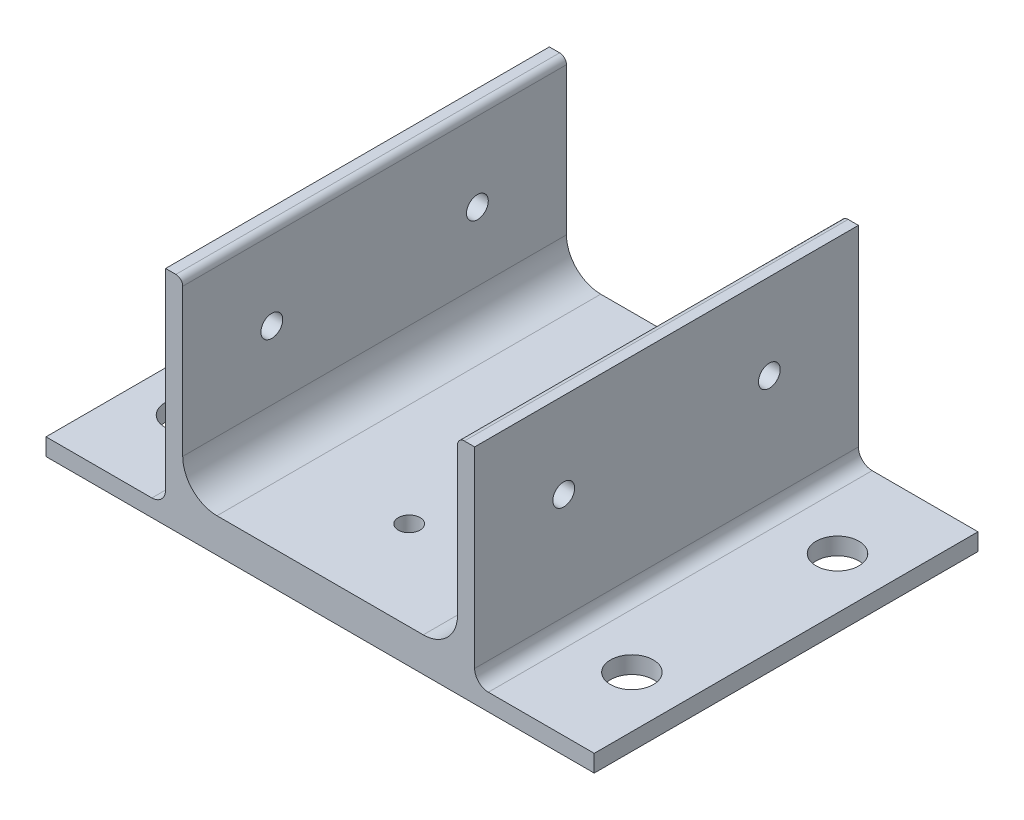
ISO-10303-21;
HEADER;
FILE_DESCRIPTION(('STEP AP214'),'2;1');
FILE_NAME('part.step','',(''),(''),'','','');
FILE_SCHEMA(('AUTOMOTIVE_DESIGN { 1 0 10303 214 1 1 1 1 }'));
ENDSEC;
DATA;
#1=APPLICATION_CONTEXT('core data for automotive mechanical design processes');
#2=APPLICATION_PROTOCOL_DEFINITION('international standard','automotive_design',2000,#1);
#3=PRODUCT_CONTEXT('',#1,'mechanical');
#4=PRODUCT('Part','Part','',(#3));
#5=PRODUCT_RELATED_PRODUCT_CATEGORY('part','',(#4));
#6=PRODUCT_DEFINITION_FORMATION('','',#4);
#7=PRODUCT_DEFINITION_CONTEXT('part definition',#1,'design');
#8=PRODUCT_DEFINITION('design','',#6,#7);
#9=PRODUCT_DEFINITION_SHAPE('','',#8);
#10=(LENGTH_UNIT() NAMED_UNIT(*) SI_UNIT(.MILLI.,.METRE.));
#11=(NAMED_UNIT(*) PLANE_ANGLE_UNIT() SI_UNIT($,.RADIAN.));
#12=(NAMED_UNIT(*) SI_UNIT($,.STERADIAN.) SOLID_ANGLE_UNIT());
#13=UNCERTAINTY_MEASURE_WITH_UNIT(LENGTH_MEASURE(1.E-05),#10,'distance_accuracy_value','');
#14=(GEOMETRIC_REPRESENTATION_CONTEXT(3) GLOBAL_UNCERTAINTY_ASSIGNED_CONTEXT((#13)) GLOBAL_UNIT_ASSIGNED_CONTEXT((#10,
#11,#12)) REPRESENTATION_CONTEXT('',''));
#15=CARTESIAN_POINT('',(0.,0.,0.));
#16=DIRECTION('',(0.,0.,1.));
#17=DIRECTION('',(1.,0.,0.));
#18=AXIS2_PLACEMENT_3D('',#15,#16,#17);
#19=CARTESIAN_POINT('',(25.4635,34.925,54.61));
#20=DIRECTION('',(0.,-1.,0.));
#21=DIRECTION('',(1.,0.,0.));
#22=AXIS2_PLACEMENT_3D('',#19,#20,#21);
#23=CYLINDRICAL_SURFACE('',#22,2.0193);
#24=CARTESIAN_POINT('',(25.4635,0.,54.61));
#25=DIRECTION('',(0.,-1.,0.));
#26=DIRECTION('',(1.,0.,0.));
#27=AXIS2_PLACEMENT_3D('',#24,#25,#26);
#28=CIRCLE('',#27,2.0193);
#29=CARTESIAN_POINT('',(27.4828,0.,54.61));
#30=VERTEX_POINT('',#29);
#31=EDGE_CURVE('E401',#30,#30,#28,.T.);
#32=ORIENTED_EDGE('',*,*,#31,.F.);
#33=EDGE_LOOP('',(#32));
#34=FACE_BOUND('',#33,.T.);
#35=CARTESIAN_POINT('',(25.4635,-3.17499999999999,54.61));
#36=DIRECTION('',(0.,-1.,0.));
#37=DIRECTION('',(1.,0.,0.));
#38=AXIS2_PLACEMENT_3D('',#35,#36,#37);
#39=CIRCLE('',#38,2.0193);
#40=CARTESIAN_POINT('',(27.4828,-3.17499999999999,54.61));
#41=VERTEX_POINT('',#40);
#42=EDGE_CURVE('E42',#41,#41,#39,.F.);
#43=ORIENTED_EDGE('',*,*,#42,.F.);
#44=EDGE_LOOP('',(#43));
#45=FACE_BOUND('',#44,.T.);
#46=ADVANCED_FACE('F38',(#34,#45),#23,.F.);
#47=CARTESIAN_POINT('',(25.4635,34.925,16.51));
#48=DIRECTION('',(0.,-1.,0.));
#49=DIRECTION('',(1.,0.,0.));
#50=AXIS2_PLACEMENT_3D('',#47,#48,#49);
#51=CYLINDRICAL_SURFACE('',#50,2.0193);
#52=CARTESIAN_POINT('',(25.4635,0.,16.51));
#53=DIRECTION('',(0.,-1.,0.));
#54=DIRECTION('',(1.,0.,0.));
#55=AXIS2_PLACEMENT_3D('',#52,#53,#54);
#56=CIRCLE('',#55,2.0193);
#57=CARTESIAN_POINT('',(27.4828,0.,16.51));
#58=VERTEX_POINT('',#57);
#59=EDGE_CURVE('E405',#58,#58,#56,.T.);
#60=ORIENTED_EDGE('',*,*,#59,.F.);
#61=EDGE_LOOP('',(#60));
#62=FACE_BOUND('',#61,.T.);
#63=CARTESIAN_POINT('',(25.4635,-3.17499999999999,16.51));
#64=DIRECTION('',(0.,-1.,0.));
#65=DIRECTION('',(1.,0.,0.));
#66=AXIS2_PLACEMENT_3D('',#63,#64,#65);
#67=CIRCLE('',#66,2.0193);
#68=CARTESIAN_POINT('',(27.4828,-3.17499999999999,16.51));
#69=VERTEX_POINT('',#68);
#70=EDGE_CURVE('E353',#69,#69,#67,.F.);
#71=ORIENTED_EDGE('',*,*,#70,.F.);
#72=EDGE_LOOP('',(#71));
#73=FACE_BOUND('',#72,.T.);
#74=ADVANCED_FACE('F471',(#62,#73),#51,.F.);
#75=CARTESIAN_POINT('',(6.35,6.34999999999999,71.12));
#76=DIRECTION('',(0.,0.,-1.));
#77=DIRECTION('',(-1.,0.,0.));
#78=AXIS2_PLACEMENT_3D('',#75,#76,#77);
#79=CYLINDRICAL_SURFACE('',#78,6.35);
#80=CARTESIAN_POINT('',(6.35,6.34999999999999,0.));
#81=DIRECTION('',(0.,0.,-1.));
#82=DIRECTION('',(1.,0.,0.));
#83=AXIS2_PLACEMENT_3D('',#80,#81,#82);
#84=CIRCLE('',#83,6.35);
#85=CARTESIAN_POINT('',(6.35,0.,0.));
#86=VERTEX_POINT('',#85);
#87=CARTESIAN_POINT('',(0.,6.34999999999999,0.));
#88=VERTEX_POINT('',#87);
#89=EDGE_CURVE('E224',#86,#88,#84,.T.);
#90=ORIENTED_EDGE('',*,*,#89,.T.);
#91=DIRECTION('',(0.,0.,-1.));
#92=VECTOR('',#91,1.);
#93=CARTESIAN_POINT('',(0.,6.34999999999999,71.12));
#94=LINE('',#93,#92);
#95=CARTESIAN_POINT('',(0.,6.34999999999999,71.12));
#96=VERTEX_POINT('',#95);
#97=EDGE_CURVE('E281',#96,#88,#94,.T.);
#98=ORIENTED_EDGE('',*,*,#97,.F.);
#99=CARTESIAN_POINT('',(6.35,6.34999999999999,71.12));
#100=DIRECTION('',(0.,0.,-1.));
#101=DIRECTION('',(1.,0.,0.));
#102=AXIS2_PLACEMENT_3D('',#99,#100,#101);
#103=CIRCLE('',#102,6.35);
#104=CARTESIAN_POINT('',(6.35,0.,71.12));
#105=VERTEX_POINT('',#104);
#106=EDGE_CURVE('E225',#105,#96,#103,.T.);
#107=ORIENTED_EDGE('',*,*,#106,.F.);
#108=DIRECTION('',(0.,0.,-1.));
#109=VECTOR('',#108,1.);
#110=CARTESIAN_POINT('',(6.35,0.,71.12));
#111=LINE('',#110,#109);
#112=EDGE_CURVE('E246',#105,#86,#111,.T.);
#113=ORIENTED_EDGE('',*,*,#112,.T.);
#114=EDGE_LOOP('',(#90,#98,#107,#113));
#115=FACE_BOUND('',#114,.T.);
#116=ADVANCED_FACE('F478',(#115),#79,.F.);
#117=CARTESIAN_POINT('',(0.,6.34999999999999,71.12));
#118=DIRECTION('',(-1.,0.,0.));
#119=DIRECTION('',(0.,-1.,0.));
#120=AXIS2_PLACEMENT_3D('',#117,#118,#119);
#121=PLANE('',#120);
#122=CARTESIAN_POINT('',(0.,19.05,16.51));
#123=DIRECTION('',(-1.,0.,0.));
#124=DIRECTION('',(0.,-1.,0.));
#125=AXIS2_PLACEMENT_3D('',#122,#123,#124);
#126=CIRCLE('',#125,2.0193);
#127=CARTESIAN_POINT('',(0.,17.0307,16.51));
#128=VERTEX_POINT('',#127);
#129=EDGE_CURVE('E425',#128,#128,#126,.T.);
#130=ORIENTED_EDGE('',*,*,#129,.T.);
#131=EDGE_LOOP('',(#130));
#132=FACE_BOUND('',#131,.T.);
#133=CARTESIAN_POINT('',(0.,19.05,54.61));
#134=DIRECTION('',(-1.,0.,0.));
#135=DIRECTION('',(0.,-1.,0.));
#136=AXIS2_PLACEMENT_3D('',#133,#134,#135);
#137=CIRCLE('',#136,2.0193);
#138=CARTESIAN_POINT('',(0.,17.0307,54.61));
#139=VERTEX_POINT('',#138);
#140=EDGE_CURVE('E323',#139,#139,#137,.T.);
#141=ORIENTED_EDGE('',*,*,#140,.T.);
#142=EDGE_LOOP('',(#141));
#143=FACE_BOUND('',#142,.T.);
#144=DIRECTION('',(0.,1.,0.));
#145=VECTOR('',#144,1.);
#146=CARTESIAN_POINT('',(0.,6.34999999999999,0.));
#147=LINE('',#146,#145);
#148=CARTESIAN_POINT('',(0.,33.655,0.));
#149=VERTEX_POINT('',#148);
#150=EDGE_CURVE('E250',#88,#149,#147,.T.);
#151=ORIENTED_EDGE('',*,*,#150,.T.);
#152=DIRECTION('',(0.,0.,-1.));
#153=VECTOR('',#152,1.);
#154=CARTESIAN_POINT('',(0.,33.655,71.12));
#155=LINE('',#154,#153);
#156=CARTESIAN_POINT('',(0.,33.655,71.12));
#157=VERTEX_POINT('',#156);
#158=EDGE_CURVE('E277',#157,#149,#155,.T.);
#159=ORIENTED_EDGE('',*,*,#158,.F.);
#160=DIRECTION('',(0.,1.,0.));
#161=VECTOR('',#160,1.);
#162=CARTESIAN_POINT('',(0.,6.34999999999999,71.12));
#163=LINE('',#162,#161);
#164=EDGE_CURVE('E229',#96,#157,#163,.T.);
#165=ORIENTED_EDGE('',*,*,#164,.F.);
#166=ORIENTED_EDGE('',*,*,#97,.T.);
#167=EDGE_LOOP('',(#151,#159,#165,#166));
#168=FACE_BOUND('',#167,.T.);
#169=ADVANCED_FACE('F537',(#132,#143,#168),#121,.F.);
#170=CARTESIAN_POINT('',(-1.27,33.655,71.12));
#171=DIRECTION('',(0.,0.,-1.));
#172=DIRECTION('',(-1.,0.,0.));
#173=AXIS2_PLACEMENT_3D('',#170,#171,#172);
#174=CYLINDRICAL_SURFACE('',#173,1.27);
#175=CARTESIAN_POINT('',(-1.27,33.655,0.));
#176=DIRECTION('',(0.,0.,1.));
#177=DIRECTION('',(1.,0.,0.));
#178=AXIS2_PLACEMENT_3D('',#175,#176,#177);
#179=CIRCLE('',#178,1.27);
#180=CARTESIAN_POINT('',(-1.27,34.925,0.));
#181=VERTEX_POINT('',#180);
#182=EDGE_CURVE('E253',#149,#181,#179,.T.);
#183=ORIENTED_EDGE('',*,*,#182,.T.);
#184=DIRECTION('',(0.,0.,-1.));
#185=VECTOR('',#184,1.);
#186=CARTESIAN_POINT('',(-1.27,34.925,71.12));
#187=LINE('',#186,#185);
#188=CARTESIAN_POINT('',(-1.27,34.925,71.12));
#189=VERTEX_POINT('',#188);
#190=EDGE_CURVE('E273',#189,#181,#187,.T.);
#191=ORIENTED_EDGE('',*,*,#190,.F.);
#192=CARTESIAN_POINT('',(-1.27,33.655,71.12));
#193=DIRECTION('',(0.,0.,1.));
#194=DIRECTION('',(1.,0.,0.));
#195=AXIS2_PLACEMENT_3D('',#192,#193,#194);
#196=CIRCLE('',#195,1.27);
#197=EDGE_CURVE('E233',#157,#189,#196,.T.);
#198=ORIENTED_EDGE('',*,*,#197,.F.);
#199=ORIENTED_EDGE('',*,*,#158,.T.);
#200=EDGE_LOOP('',(#183,#191,#198,#199));
#201=FACE_BOUND('',#200,.T.);
#202=ADVANCED_FACE('F533',(#201),#174,.T.);
#203=CARTESIAN_POINT('',(-1.27,34.925,71.12));
#204=DIRECTION('',(0.,-1.,0.));
#205=DIRECTION('',(0.,0.,-1.));
#206=AXIS2_PLACEMENT_3D('',#203,#204,#205);
#207=PLANE('',#206);
#208=DIRECTION('',(-1.,0.,0.));
#209=VECTOR('',#208,1.);
#210=CARTESIAN_POINT('',(-1.27,34.925,0.));
#211=LINE('',#210,#209);
#212=CARTESIAN_POINT('',(-3.175,34.925,0.));
#213=VERTEX_POINT('',#212);
#214=EDGE_CURVE('E256',#181,#213,#211,.T.);
#215=ORIENTED_EDGE('',*,*,#214,.T.);
#216=DIRECTION('',(0.,0.,-1.));
#217=VECTOR('',#216,1.);
#218=CARTESIAN_POINT('',(-3.175,34.925,71.12));
#219=LINE('',#218,#217);
#220=CARTESIAN_POINT('',(-3.175,34.925,71.12));
#221=VERTEX_POINT('',#220);
#222=EDGE_CURVE('E269',#221,#213,#219,.T.);
#223=ORIENTED_EDGE('',*,*,#222,.F.);
#224=DIRECTION('',(-1.,0.,0.));
#225=VECTOR('',#224,1.);
#226=CARTESIAN_POINT('',(-1.27,34.925,71.12));
#227=LINE('',#226,#225);
#228=EDGE_CURVE('E236',#189,#221,#227,.T.);
#229=ORIENTED_EDGE('',*,*,#228,.F.);
#230=ORIENTED_EDGE('',*,*,#190,.T.);
#231=EDGE_LOOP('',(#215,#223,#229,#230));
#232=FACE_BOUND('',#231,.T.);
#233=ADVANCED_FACE('F528',(#232),#207,.F.);
#234=CARTESIAN_POINT('',(-3.17500000000001,-3.17499999999999,71.12));
#235=DIRECTION('',(1.,0.,0.));
#236=DIRECTION('',(0.,1.,0.));
#237=AXIS2_PLACEMENT_3D('',#234,#235,#236);
#238=PLANE('',#237);
#239=CARTESIAN_POINT('',(-3.175,19.05,16.51));
#240=DIRECTION('',(-1.,0.,0.));
#241=DIRECTION('',(0.,-1.,0.));
#242=AXIS2_PLACEMENT_3D('',#239,#240,#241);
#243=CIRCLE('',#242,2.0193);
#244=CARTESIAN_POINT('',(-3.175,17.0307,16.51));
#245=VERTEX_POINT('',#244);
#246=EDGE_CURVE('E317',#245,#245,#243,.T.);
#247=ORIENTED_EDGE('',*,*,#246,.F.);
#248=EDGE_LOOP('',(#247));
#249=FACE_BOUND('',#248,.T.);
#250=CARTESIAN_POINT('',(-3.175,19.05,54.61));
#251=DIRECTION('',(-1.,0.,0.));
#252=DIRECTION('',(0.,-1.,0.));
#253=AXIS2_PLACEMENT_3D('',#250,#251,#252);
#254=CIRCLE('',#253,2.0193);
#255=CARTESIAN_POINT('',(-3.175,17.0307,54.61));
#256=VERTEX_POINT('',#255);
#257=EDGE_CURVE('E409',#256,#256,#254,.T.);
#258=ORIENTED_EDGE('',*,*,#257,.F.);
#259=EDGE_LOOP('',(#258));
#260=FACE_BOUND('',#259,.T.);
#261=DIRECTION('',(0.,-1.,0.));
#262=VECTOR('',#261,1.);
#263=CARTESIAN_POINT('',(-3.17500000000001,-3.17499999999999,0.));
#264=LINE('',#263,#262);
#265=CARTESIAN_POINT('',(-3.175,-0.634999999999995,0.));
#266=VERTEX_POINT('',#265);
#267=EDGE_CURVE('E260',#213,#266,#264,.T.);
#268=ORIENTED_EDGE('',*,*,#267,.T.);
#269=DIRECTION('',(0.,0.,-1.));
#270=VECTOR('',#269,1.);
#271=CARTESIAN_POINT('',(-3.175,-0.634999999999995,71.12));
#272=LINE('',#271,#270);
#273=CARTESIAN_POINT('',(-3.175,-0.634999999999997,71.12));
#274=VERTEX_POINT('',#273);
#275=EDGE_CURVE('E337',#266,#274,#272,.F.);
#276=ORIENTED_EDGE('',*,*,#275,.T.);
#277=DIRECTION('',(0.,-1.,0.));
#278=VECTOR('',#277,1.);
#279=CARTESIAN_POINT('',(-3.175,34.925,71.12));
#280=LINE('',#279,#278);
#281=EDGE_CURVE('E239',#221,#274,#280,.T.);
#282=ORIENTED_EDGE('',*,*,#281,.F.);
#283=ORIENTED_EDGE('',*,*,#222,.T.);
#284=EDGE_LOOP('',(#268,#276,#282,#283));
#285=FACE_BOUND('',#284,.T.);
#286=ADVANCED_FACE('F523',(#249,#260,#285),#238,.F.);
#287=CARTESIAN_POINT('',(33.655,0.,71.12));
#288=DIRECTION('',(0.,-1.,0.));
#289=DIRECTION('',(1.,0.,0.));
#290=AXIS2_PLACEMENT_3D('',#287,#288,#289);
#291=PLANE('',#290);
#292=ORIENTED_EDGE('',*,*,#59,.T.);
#293=EDGE_LOOP('',(#292));
#294=FACE_BOUND('',#293,.T.);
#295=ORIENTED_EDGE('',*,*,#31,.T.);
#296=EDGE_LOOP('',(#295));
#297=FACE_BOUND('',#296,.T.);
#298=DIRECTION('',(-1.,0.,0.));
#299=VECTOR('',#298,1.);
#300=CARTESIAN_POINT('',(33.655,0.,71.12));
#301=LINE('',#300,#299);
#302=CARTESIAN_POINT('',(44.577,0.,71.12));
#303=VERTEX_POINT('',#302);
#304=EDGE_CURVE('E243',#303,#105,#301,.T.);
#305=ORIENTED_EDGE('',*,*,#304,.F.);
#306=DIRECTION('',(0.,0.,-1.));
#307=VECTOR('',#306,1.);
#308=CARTESIAN_POINT('',(44.577,0.,71.12));
#309=LINE('',#308,#307);
#310=CARTESIAN_POINT('',(44.577,0.,0.));
#311=VERTEX_POINT('',#310);
#312=EDGE_CURVE('E285',#303,#311,#309,.T.);
#313=ORIENTED_EDGE('',*,*,#312,.T.);
#314=DIRECTION('',(-1.,0.,0.));
#315=VECTOR('',#314,1.);
#316=CARTESIAN_POINT('',(33.655,0.,0.));
#317=LINE('',#316,#315);
#318=EDGE_CURVE('E230',#311,#86,#317,.T.);
#319=ORIENTED_EDGE('',*,*,#318,.T.);
#320=ORIENTED_EDGE('',*,*,#112,.F.);
#321=EDGE_LOOP('',(#305,#313,#319,#320));
#322=FACE_BOUND('',#321,.T.);
#323=ADVANCED_FACE('F546',(#294,#297,#322),#291,.F.);
#324=CARTESIAN_POINT('',(6.35,6.34999999999999,71.12));
#325=DIRECTION('',(0.,0.,1.));
#326=DIRECTION('',(1.,0.,0.));
#327=AXIS2_PLACEMENT_3D('',#324,#325,#326);
#328=PLANE('',#327);
#329=DIRECTION('',(1.,0.,0.));
#330=VECTOR('',#329,1.);
#331=CARTESIAN_POINT('',(54.102,34.925,71.12));
#332=LINE('',#331,#330);
#333=CARTESIAN_POINT('',(52.197,34.925,71.12));
#334=VERTEX_POINT('',#333);
#335=CARTESIAN_POINT('',(54.102,34.925,71.12));
#336=VERTEX_POINT('',#335);
#337=EDGE_CURVE('E208',#334,#336,#332,.T.);
#338=ORIENTED_EDGE('',*,*,#337,.F.);
#339=CARTESIAN_POINT('',(52.197,33.655,71.12));
#340=DIRECTION('',(0.,0.,1.));
#341=DIRECTION('',(1.,0.,0.));
#342=AXIS2_PLACEMENT_3D('',#339,#340,#341);
#343=CIRCLE('',#342,1.27);
#344=CARTESIAN_POINT('',(50.927,33.655,71.12));
#345=VERTEX_POINT('',#344);
#346=EDGE_CURVE('E308',#334,#345,#343,.T.);
#347=ORIENTED_EDGE('',*,*,#346,.T.);
#348=DIRECTION('',(0.,1.,0.));
#349=VECTOR('',#348,1.);
#350=CARTESIAN_POINT('',(50.927,34.925,71.12));
#351=LINE('',#350,#349);
#352=CARTESIAN_POINT('',(50.927,6.35000000000001,71.12));
#353=VERTEX_POINT('',#352);
#354=EDGE_CURVE('E204',#353,#345,#351,.T.);
#355=ORIENTED_EDGE('',*,*,#354,.F.);
#356=CARTESIAN_POINT('',(44.577,6.35,71.12));
#357=DIRECTION('',(0.,0.,1.));
#358=DIRECTION('',(1.,0.,0.));
#359=AXIS2_PLACEMENT_3D('',#356,#357,#358);
#360=CIRCLE('',#359,6.35);
#361=EDGE_CURVE('E295',#353,#303,#360,.F.);
#362=ORIENTED_EDGE('',*,*,#361,.T.);
#363=ORIENTED_EDGE('',*,*,#304,.T.);
#364=ORIENTED_EDGE('',*,*,#106,.T.);
#365=ORIENTED_EDGE('',*,*,#164,.T.);
#366=ORIENTED_EDGE('',*,*,#197,.T.);
#367=ORIENTED_EDGE('',*,*,#228,.T.);
#368=ORIENTED_EDGE('',*,*,#281,.T.);
#369=CARTESIAN_POINT('',(-5.715,-0.634999999999985,71.12));
#370=DIRECTION('',(0.,0.,1.));
#371=DIRECTION('',(1.,0.,0.));
#372=AXIS2_PLACEMENT_3D('',#369,#370,#371);
#373=CIRCLE('',#372,2.54);
#374=CARTESIAN_POINT('',(-5.71500000000001,-3.17499999999999,71.12));
#375=VERTEX_POINT('',#374);
#376=EDGE_CURVE('E349',#274,#375,#373,.F.);
#377=ORIENTED_EDGE('',*,*,#376,.T.);
#378=DIRECTION('',(-1.,0.,0.));
#379=VECTOR('',#378,1.);
#380=CARTESIAN_POINT('',(-25.3365,-3.17499999999998,71.12));
#381=LINE('',#380,#379);
#382=CARTESIAN_POINT('',(-25.3365,-3.17499999999998,71.12));
#383=VERTEX_POINT('',#382);
#384=EDGE_CURVE('E443',#375,#383,#381,.T.);
#385=ORIENTED_EDGE('',*,*,#384,.T.);
#386=DIRECTION('',(0.,1.,0.));
#387=VECTOR('',#386,1.);
#388=CARTESIAN_POINT('',(-25.3365,-6.34999999999998,71.12));
#389=LINE('',#388,#387);
#390=CARTESIAN_POINT('',(-25.3365,-6.34999999999998,71.12));
#391=VERTEX_POINT('',#390);
#392=EDGE_CURVE('E433',#391,#383,#389,.T.);
#393=ORIENTED_EDGE('',*,*,#392,.F.);
#394=DIRECTION('',(-1.,0.,0.));
#395=VECTOR('',#394,1.);
#396=CARTESIAN_POINT('',(-25.3365,-6.34999999999998,71.12));
#397=LINE('',#396,#395);
#398=CARTESIAN_POINT('',(76.2635,-6.35,71.1199999999999));
#399=VERTEX_POINT('',#398);
#400=EDGE_CURVE('E183',#399,#391,#397,.T.);
#401=ORIENTED_EDGE('',*,*,#400,.F.);
#402=DIRECTION('',(0.,1.,0.));
#403=VECTOR('',#402,1.);
#404=CARTESIAN_POINT('',(76.2635,-6.35,71.1199999999999));
#405=LINE('',#404,#403);
#406=CARTESIAN_POINT('',(76.2635,-3.175,71.1199999999999));
#407=VERTEX_POINT('',#406);
#408=EDGE_CURVE('E200',#399,#407,#405,.T.);
#409=ORIENTED_EDGE('',*,*,#408,.T.);
#410=CARTESIAN_POINT('',(56.642,-3.175,71.1199999999999));
#411=VERTEX_POINT('',#410);
#412=EDGE_CURVE('E188',#407,#411,#381,.T.);
#413=ORIENTED_EDGE('',*,*,#412,.T.);
#414=CARTESIAN_POINT('',(56.642,-0.634999999999998,71.12));
#415=DIRECTION('',(0.,0.,1.));
#416=DIRECTION('',(1.,0.,0.));
#417=AXIS2_PLACEMENT_3D('',#414,#415,#416);
#418=CIRCLE('',#417,2.54);
#419=CARTESIAN_POINT('',(54.102,-0.634999999999998,71.12));
#420=VERTEX_POINT('',#419);
#421=EDGE_CURVE('E11',#411,#420,#418,.F.);
#422=ORIENTED_EDGE('',*,*,#421,.T.);
#423=DIRECTION('',(0.,-1.,0.));
#424=VECTOR('',#423,1.);
#425=CARTESIAN_POINT('',(54.102,-3.17499999999999,71.12));
#426=LINE('',#425,#424);
#427=EDGE_CURVE('E212',#336,#420,#426,.T.);
#428=ORIENTED_EDGE('',*,*,#427,.F.);
#429=EDGE_LOOP('',(#338,#347,#355,#362,#363,#364,#365,#366,#367,#368,#377,#385,#393,#401,#409,
#413,#422,#428));
#430=FACE_BOUND('',#429,.T.);
#431=ADVANCED_FACE('F452',(#430),#328,.T.);
#432=CARTESIAN_POINT('',(6.35,6.34999999999999,0.));
#433=DIRECTION('',(0.,0.,1.));
#434=DIRECTION('',(1.,0.,0.));
#435=AXIS2_PLACEMENT_3D('',#432,#433,#434);
#436=PLANE('',#435);
#437=DIRECTION('',(0.,1.,0.));
#438=VECTOR('',#437,1.);
#439=CARTESIAN_POINT('',(50.927,34.925,0.));
#440=LINE('',#439,#438);
#441=CARTESIAN_POINT('',(50.927,6.35000000000001,0.));
#442=VERTEX_POINT('',#441);
#443=CARTESIAN_POINT('',(50.927,33.655,0.));
#444=VERTEX_POINT('',#443);
#445=EDGE_CURVE('E194',#442,#444,#440,.T.);
#446=ORIENTED_EDGE('',*,*,#445,.T.);
#447=CARTESIAN_POINT('',(52.197,33.655,0.));
#448=DIRECTION('',(0.,0.,1.));
#449=DIRECTION('',(1.,0.,0.));
#450=AXIS2_PLACEMENT_3D('',#447,#448,#449);
#451=CIRCLE('',#450,1.27);
#452=CARTESIAN_POINT('',(52.197,34.925,0.));
#453=VERTEX_POINT('',#452);
#454=EDGE_CURVE('E302',#444,#453,#451,.F.);
#455=ORIENTED_EDGE('',*,*,#454,.T.);
#456=DIRECTION('',(1.,0.,0.));
#457=VECTOR('',#456,1.);
#458=CARTESIAN_POINT('',(54.102,34.925,0.));
#459=LINE('',#458,#457);
#460=CARTESIAN_POINT('',(54.102,34.925,0.));
#461=VERTEX_POINT('',#460);
#462=EDGE_CURVE('E198',#453,#461,#459,.T.);
#463=ORIENTED_EDGE('',*,*,#462,.T.);
#464=DIRECTION('',(0.,-1.,0.));
#465=VECTOR('',#464,1.);
#466=CARTESIAN_POINT('',(54.102,-3.17499999999999,0.));
#467=LINE('',#466,#465);
#468=CARTESIAN_POINT('',(54.102,-0.634999999999998,0.));
#469=VERTEX_POINT('',#468);
#470=EDGE_CURVE('E209',#461,#469,#467,.T.);
#471=ORIENTED_EDGE('',*,*,#470,.T.);
#472=CARTESIAN_POINT('',(56.642,-0.634999999999998,0.));
#473=DIRECTION('',(0.,0.,1.));
#474=DIRECTION('',(1.,0.,0.));
#475=AXIS2_PLACEMENT_3D('',#472,#473,#474);
#476=CIRCLE('',#475,2.54);
#477=CARTESIAN_POINT('',(56.642,-3.175,0.));
#478=VERTEX_POINT('',#477);
#479=EDGE_CURVE('E48',#469,#478,#476,.T.);
#480=ORIENTED_EDGE('',*,*,#479,.T.);
#481=DIRECTION('',(1.,0.,0.));
#482=VECTOR('',#481,1.);
#483=CARTESIAN_POINT('',(-25.3365,-3.17499999999998,0.));
#484=LINE('',#483,#482);
#485=CARTESIAN_POINT('',(76.2635,-3.175,0.));
#486=VERTEX_POINT('',#485);
#487=EDGE_CURVE('E436',#478,#486,#484,.T.);
#488=ORIENTED_EDGE('',*,*,#487,.T.);
#489=DIRECTION('',(0.,1.,0.));
#490=VECTOR('',#489,1.);
#491=CARTESIAN_POINT('',(76.2635,-6.35,0.));
#492=LINE('',#491,#490);
#493=CARTESIAN_POINT('',(76.2635,-6.35,0.));
#494=VERTEX_POINT('',#493);
#495=EDGE_CURVE('E173',#494,#486,#492,.T.);
#496=ORIENTED_EDGE('',*,*,#495,.F.);
#497=DIRECTION('',(1.,0.,0.));
#498=VECTOR('',#497,1.);
#499=CARTESIAN_POINT('',(-25.3365,-6.34999999999998,0.));
#500=LINE('',#499,#498);
#501=CARTESIAN_POINT('',(-25.3365,-6.34999999999998,0.));
#502=VERTEX_POINT('',#501);
#503=EDGE_CURVE('E164',#502,#494,#500,.T.);
#504=ORIENTED_EDGE('',*,*,#503,.F.);
#505=DIRECTION('',(0.,1.,0.));
#506=VECTOR('',#505,1.);
#507=CARTESIAN_POINT('',(-25.3365,-6.34999999999998,0.));
#508=LINE('',#507,#506);
#509=CARTESIAN_POINT('',(-25.3365,-3.17499999999998,0.));
#510=VERTEX_POINT('',#509);
#511=EDGE_CURVE('E170',#502,#510,#508,.T.);
#512=ORIENTED_EDGE('',*,*,#511,.T.);
#513=CARTESIAN_POINT('',(-5.715,-3.17499999999999,0.));
#514=VERTEX_POINT('',#513);
#515=EDGE_CURVE('E437',#510,#514,#484,.T.);
#516=ORIENTED_EDGE('',*,*,#515,.T.);
#517=CARTESIAN_POINT('',(-5.715,-0.634999999999985,0.));
#518=DIRECTION('',(0.,0.,1.));
#519=DIRECTION('',(1.,0.,0.));
#520=AXIS2_PLACEMENT_3D('',#517,#518,#519);
#521=CIRCLE('',#520,2.54);
#522=EDGE_CURVE('E346',#514,#266,#521,.T.);
#523=ORIENTED_EDGE('',*,*,#522,.T.);
#524=ORIENTED_EDGE('',*,*,#267,.F.);
#525=ORIENTED_EDGE('',*,*,#214,.F.);
#526=ORIENTED_EDGE('',*,*,#182,.F.);
#527=ORIENTED_EDGE('',*,*,#150,.F.);
#528=ORIENTED_EDGE('',*,*,#89,.F.);
#529=ORIENTED_EDGE('',*,*,#318,.F.);
#530=CARTESIAN_POINT('',(44.577,6.35,0.));
#531=DIRECTION('',(0.,0.,1.));
#532=DIRECTION('',(1.,0.,0.));
#533=AXIS2_PLACEMENT_3D('',#530,#531,#532);
#534=CIRCLE('',#533,6.35);
#535=EDGE_CURVE('E292',#311,#442,#534,.T.);
#536=ORIENTED_EDGE('',*,*,#535,.T.);
#537=EDGE_LOOP('',(#446,#455,#463,#471,#480,#488,#496,#504,#512,#516,#523,#524,#525,#526,#527,
#528,#529,#536));
#538=FACE_BOUND('',#537,.T.);
#539=ADVANCED_FACE('F167',(#538),#436,.F.);
#540=CARTESIAN_POINT('',(54.102,-3.17499999999999,71.12));
#541=DIRECTION('',(1.,0.,0.));
#542=DIRECTION('',(0.,0.,-1.));
#543=AXIS2_PLACEMENT_3D('',#540,#541,#542);
#544=PLANE('',#543);
#545=CARTESIAN_POINT('',(54.102,19.05,16.51));
#546=DIRECTION('',(1.,0.,0.));
#547=DIRECTION('',(0.,0.,-1.));
#548=AXIS2_PLACEMENT_3D('',#545,#546,#547);
#549=CIRCLE('',#548,2.0193);
#550=CARTESIAN_POINT('',(54.102,19.05,14.4907));
#551=VERTEX_POINT('',#550);
#552=EDGE_CURVE('E322',#551,#551,#549,.T.);
#553=ORIENTED_EDGE('',*,*,#552,.F.);
#554=EDGE_LOOP('',(#553));
#555=FACE_BOUND('',#554,.T.);
#556=CARTESIAN_POINT('',(54.102,19.05,54.61));
#557=DIRECTION('',(1.,0.,0.));
#558=DIRECTION('',(0.,0.,-1.));
#559=AXIS2_PLACEMENT_3D('',#556,#557,#558);
#560=CIRCLE('',#559,2.0193);
#561=CARTESIAN_POINT('',(54.102,19.05,52.5907));
#562=VERTEX_POINT('',#561);
#563=EDGE_CURVE('E316',#562,#562,#560,.T.);
#564=ORIENTED_EDGE('',*,*,#563,.F.);
#565=EDGE_LOOP('',(#564));
#566=FACE_BOUND('',#565,.T.);
#567=ORIENTED_EDGE('',*,*,#427,.T.);
#568=DIRECTION('',(0.,0.,-1.));
#569=VECTOR('',#568,1.);
#570=CARTESIAN_POINT('',(54.102,-0.634999999999998,71.12));
#571=LINE('',#570,#569);
#572=EDGE_CURVE('E340',#420,#469,#571,.T.);
#573=ORIENTED_EDGE('',*,*,#572,.T.);
#574=ORIENTED_EDGE('',*,*,#470,.F.);
#575=DIRECTION('',(0.,0.,-1.));
#576=VECTOR('',#575,1.);
#577=CARTESIAN_POINT('',(54.102,34.925,71.12));
#578=LINE('',#577,#576);
#579=EDGE_CURVE('E215',#336,#461,#578,.T.);
#580=ORIENTED_EDGE('',*,*,#579,.F.);
#581=EDGE_LOOP('',(#567,#573,#574,#580));
#582=FACE_BOUND('',#581,.T.);
#583=ADVANCED_FACE('F564',(#555,#566,#582),#544,.T.);
#584=CARTESIAN_POINT('',(54.102,34.925,71.12));
#585=DIRECTION('',(0.,1.,0.));
#586=DIRECTION('',(0.,0.,1.));
#587=AXIS2_PLACEMENT_3D('',#584,#585,#586);
#588=PLANE('',#587);
#589=ORIENTED_EDGE('',*,*,#462,.F.);
#590=DIRECTION('',(0.,0.,-1.));
#591=VECTOR('',#590,1.);
#592=CARTESIAN_POINT('',(52.197,34.925,71.12));
#593=LINE('',#592,#591);
#594=EDGE_CURVE('E305',#453,#334,#593,.F.);
#595=ORIENTED_EDGE('',*,*,#594,.T.);
#596=ORIENTED_EDGE('',*,*,#337,.T.);
#597=ORIENTED_EDGE('',*,*,#579,.T.);
#598=EDGE_LOOP('',(#589,#595,#596,#597));
#599=FACE_BOUND('',#598,.T.);
#600=ADVANCED_FACE('F560',(#599),#588,.T.);
#601=CARTESIAN_POINT('',(50.927,34.925,71.12));
#602=DIRECTION('',(-1.,0.,0.));
#603=DIRECTION('',(0.,-1.,0.));
#604=AXIS2_PLACEMENT_3D('',#601,#602,#603);
#605=PLANE('',#604);
#606=CARTESIAN_POINT('',(50.927,19.05,16.51));
#607=DIRECTION('',(-1.,0.,0.));
#608=DIRECTION('',(0.,-1.,0.));
#609=AXIS2_PLACEMENT_3D('',#606,#607,#608);
#610=CIRCLE('',#609,2.0193);
#611=CARTESIAN_POINT('',(50.927,17.0307,16.51));
#612=VERTEX_POINT('',#611);
#613=EDGE_CURVE('E318',#612,#612,#610,.T.);
#614=ORIENTED_EDGE('',*,*,#613,.F.);
#615=EDGE_LOOP('',(#614));
#616=FACE_BOUND('',#615,.T.);
#617=CARTESIAN_POINT('',(50.927,19.05,54.61));
#618=DIRECTION('',(-1.,0.,0.));
#619=DIRECTION('',(0.,-1.,0.));
#620=AXIS2_PLACEMENT_3D('',#617,#618,#619);
#621=CIRCLE('',#620,2.0193);
#622=CARTESIAN_POINT('',(50.927,17.0307,54.61));
#623=VERTEX_POINT('',#622);
#624=EDGE_CURVE('E312',#623,#623,#621,.T.);
#625=ORIENTED_EDGE('',*,*,#624,.F.);
#626=EDGE_LOOP('',(#625));
#627=FACE_BOUND('',#626,.T.);
#628=ORIENTED_EDGE('',*,*,#354,.T.);
#629=DIRECTION('',(0.,0.,-1.));
#630=VECTOR('',#629,1.);
#631=CARTESIAN_POINT('',(50.927,33.655,71.12));
#632=LINE('',#631,#630);
#633=EDGE_CURVE('E298',#345,#444,#632,.T.);
#634=ORIENTED_EDGE('',*,*,#633,.T.);
#635=ORIENTED_EDGE('',*,*,#445,.F.);
#636=DIRECTION('',(0.,0.,-1.));
#637=VECTOR('',#636,1.);
#638=CARTESIAN_POINT('',(50.927,6.35,71.12));
#639=LINE('',#638,#637);
#640=EDGE_CURVE('E289',#442,#353,#639,.F.);
#641=ORIENTED_EDGE('',*,*,#640,.T.);
#642=EDGE_LOOP('',(#628,#634,#635,#641));
#643=FACE_BOUND('',#642,.T.);
#644=ADVANCED_FACE('F553',(#616,#627,#643),#605,.T.);
#645=CARTESIAN_POINT('',(44.577,6.35,71.12));
#646=DIRECTION('',(0.,0.,-1.));
#647=DIRECTION('',(-1.,0.,0.));
#648=AXIS2_PLACEMENT_3D('',#645,#646,#647);
#649=CYLINDRICAL_SURFACE('',#648,6.35);
#650=ORIENTED_EDGE('',*,*,#361,.F.);
#651=ORIENTED_EDGE('',*,*,#640,.F.);
#652=ORIENTED_EDGE('',*,*,#535,.F.);
#653=ORIENTED_EDGE('',*,*,#312,.F.);
#654=EDGE_LOOP('',(#650,#651,#652,#653));
#655=FACE_BOUND('',#654,.T.);
#656=ADVANCED_FACE('F507',(#655),#649,.F.);
#657=CARTESIAN_POINT('',(52.197,33.655,71.12));
#658=DIRECTION('',(0.,0.,-1.));
#659=DIRECTION('',(-1.,0.,0.));
#660=AXIS2_PLACEMENT_3D('',#657,#658,#659);
#661=CYLINDRICAL_SURFACE('',#660,1.27);
#662=ORIENTED_EDGE('',*,*,#346,.F.);
#663=ORIENTED_EDGE('',*,*,#594,.F.);
#664=ORIENTED_EDGE('',*,*,#454,.F.);
#665=ORIENTED_EDGE('',*,*,#633,.F.);
#666=EDGE_LOOP('',(#662,#663,#664,#665));
#667=FACE_BOUND('',#666,.T.);
#668=ADVANCED_FACE('F501',(#667),#661,.T.);
#669=CARTESIAN_POINT('',(0.,-3.17499999999999,0.));
#670=DIRECTION('',(0.,-1.,0.));
#671=DIRECTION('',(1.,0.,0.));
#672=AXIS2_PLACEMENT_3D('',#669,#670,#671);
#673=PLANE('',#672);
#674=CARTESIAN_POINT('',(-15.8115,-3.17499999999998,54.61));
#675=DIRECTION('',(0.,-1.,0.));
#676=DIRECTION('',(1.,0.,0.));
#677=AXIS2_PLACEMENT_3D('',#674,#675,#676);
#678=CIRCLE('',#677,3.96875);
#679=CARTESIAN_POINT('',(-11.84275,-3.17499999999998,54.61));
#680=VERTEX_POINT('',#679);
#681=EDGE_CURVE('E397',#680,#680,#678,.T.);
#682=ORIENTED_EDGE('',*,*,#681,.T.);
#683=EDGE_LOOP('',(#682));
#684=FACE_BOUND('',#683,.T.);
#685=CARTESIAN_POINT('',(-15.8115,-3.17499999999998,16.51));
#686=DIRECTION('',(0.,-1.,0.));
#687=DIRECTION('',(1.,0.,0.));
#688=AXIS2_PLACEMENT_3D('',#685,#686,#687);
#689=CIRCLE('',#688,3.96875);
#690=CARTESIAN_POINT('',(-11.84275,-3.17499999999998,16.51));
#691=VERTEX_POINT('',#690);
#692=EDGE_CURVE('E333',#691,#691,#689,.T.);
#693=ORIENTED_EDGE('',*,*,#692,.T.);
#694=EDGE_LOOP('',(#693));
#695=FACE_BOUND('',#694,.T.);
#696=ORIENTED_EDGE('',*,*,#384,.F.);
#697=DIRECTION('',(0.,0.,-1.));
#698=VECTOR('',#697,1.);
#699=CARTESIAN_POINT('',(-5.715,-3.17499999999999,0.));
#700=LINE('',#699,#698);
#701=EDGE_CURVE('E311',#375,#514,#700,.T.);
#702=ORIENTED_EDGE('',*,*,#701,.T.);
#703=ORIENTED_EDGE('',*,*,#515,.F.);
#704=DIRECTION('',(0.,0.,-1.));
#705=VECTOR('',#704,1.);
#706=CARTESIAN_POINT('',(-25.3365,-3.17499999999998,71.12));
#707=LINE('',#706,#705);
#708=EDGE_CURVE('E192',#383,#510,#707,.T.);
#709=ORIENTED_EDGE('',*,*,#708,.F.);
#710=EDGE_LOOP('',(#696,#702,#703,#709));
#711=FACE_BOUND('',#710,.T.);
#712=ADVANCED_FACE('F467',(#684,#695,#711),#673,.F.);
#713=CARTESIAN_POINT('',(-25.3365,-6.34999999999998,71.12));
#714=DIRECTION('',(1.,0.,0.));
#715=DIRECTION('',(0.,1.,0.));
#716=AXIS2_PLACEMENT_3D('',#713,#714,#715);
#717=PLANE('',#716);
#718=ORIENTED_EDGE('',*,*,#708,.T.);
#719=ORIENTED_EDGE('',*,*,#511,.F.);
#720=DIRECTION('',(0.,0.,-1.));
#721=VECTOR('',#720,1.);
#722=CARTESIAN_POINT('',(-25.3365,-6.34999999999998,71.12));
#723=LINE('',#722,#721);
#724=EDGE_CURVE('E178',#391,#502,#723,.T.);
#725=ORIENTED_EDGE('',*,*,#724,.F.);
#726=ORIENTED_EDGE('',*,*,#392,.T.);
#727=EDGE_LOOP('',(#718,#719,#725,#726));
#728=FACE_BOUND('',#727,.T.);
#729=ADVANCED_FACE('F190',(#728),#717,.F.);
#730=CARTESIAN_POINT('',(76.2635,-6.35,71.1199999999999));
#731=DIRECTION('',(-1.,0.,0.));
#732=DIRECTION('',(0.,-1.,0.));
#733=AXIS2_PLACEMENT_3D('',#730,#731,#732);
#734=PLANE('',#733);
#735=DIRECTION('',(0.,0.,1.));
#736=VECTOR('',#735,1.);
#737=CARTESIAN_POINT('',(76.2635,-3.175,71.1199999999999));
#738=LINE('',#737,#736);
#739=EDGE_CURVE('E440',#486,#407,#738,.T.);
#740=ORIENTED_EDGE('',*,*,#739,.T.);
#741=ORIENTED_EDGE('',*,*,#408,.F.);
#742=DIRECTION('',(0.,0.,1.));
#743=VECTOR('',#742,1.);
#744=CARTESIAN_POINT('',(76.2635,-6.35,71.1199999999999));
#745=LINE('',#744,#743);
#746=EDGE_CURVE('E177',#494,#399,#745,.T.);
#747=ORIENTED_EDGE('',*,*,#746,.F.);
#748=ORIENTED_EDGE('',*,*,#495,.T.);
#749=EDGE_LOOP('',(#740,#741,#747,#748));
#750=FACE_BOUND('',#749,.T.);
#751=ADVANCED_FACE('F457',(#750),#734,.F.);
#752=CARTESIAN_POINT('',(0.,-6.34999999999999,0.));
#753=DIRECTION('',(0.,-1.,0.));
#754=DIRECTION('',(1.,0.,0.));
#755=AXIS2_PLACEMENT_3D('',#752,#753,#754);
#756=PLANE('',#755);
#757=CARTESIAN_POINT('',(25.4635,-6.34999999999999,54.61));
#758=DIRECTION('',(0.,-1.,0.));
#759=DIRECTION('',(1.,0.,0.));
#760=AXIS2_PLACEMENT_3D('',#757,#758,#759);
#761=CIRCLE('',#760,5.08);
#762=CARTESIAN_POINT('',(30.5435,-6.34999999999999,54.61));
#763=VERTEX_POINT('',#762);
#764=EDGE_CURVE('E364',#763,#763,#761,.T.);
#765=ORIENTED_EDGE('',*,*,#764,.F.);
#766=EDGE_LOOP('',(#765));
#767=FACE_BOUND('',#766,.T.);
#768=CARTESIAN_POINT('',(25.4635,-6.34999999999999,16.51));
#769=DIRECTION('',(0.,-1.,0.));
#770=DIRECTION('',(1.,0.,0.));
#771=AXIS2_PLACEMENT_3D('',#768,#769,#770);
#772=CIRCLE('',#771,5.08);
#773=CARTESIAN_POINT('',(30.5435,-6.34999999999999,16.51));
#774=VERTEX_POINT('',#773);
#775=EDGE_CURVE('E376',#774,#774,#772,.T.);
#776=ORIENTED_EDGE('',*,*,#775,.F.);
#777=EDGE_LOOP('',(#776));
#778=FACE_BOUND('',#777,.T.);
#779=CARTESIAN_POINT('',(66.7385,-6.35,16.51));
#780=DIRECTION('',(0.,-1.,0.));
#781=DIRECTION('',(1.,0.,0.));
#782=AXIS2_PLACEMENT_3D('',#779,#780,#781);
#783=CIRCLE('',#782,3.96874999999999);
#784=CARTESIAN_POINT('',(70.70725,-6.35,16.51));
#785=VERTEX_POINT('',#784);
#786=EDGE_CURVE('E362',#785,#785,#783,.T.);
#787=ORIENTED_EDGE('',*,*,#786,.F.);
#788=EDGE_LOOP('',(#787));
#789=FACE_BOUND('',#788,.T.);
#790=CARTESIAN_POINT('',(66.7385,-6.35,54.61));
#791=DIRECTION('',(0.,-1.,0.));
#792=DIRECTION('',(1.,0.,0.));
#793=AXIS2_PLACEMENT_3D('',#790,#791,#792);
#794=CIRCLE('',#793,3.96874999999999);
#795=CARTESIAN_POINT('',(70.70725,-6.35,54.61));
#796=VERTEX_POINT('',#795);
#797=EDGE_CURVE('E384',#796,#796,#794,.T.);
#798=ORIENTED_EDGE('',*,*,#797,.F.);
#799=EDGE_LOOP('',(#798));
#800=FACE_BOUND('',#799,.T.);
#801=CARTESIAN_POINT('',(-15.8115,-6.34999999999998,54.61));
#802=DIRECTION('',(0.,-1.,0.));
#803=DIRECTION('',(1.,0.,0.));
#804=AXIS2_PLACEMENT_3D('',#801,#802,#803);
#805=CIRCLE('',#804,3.96875);
#806=CARTESIAN_POINT('',(-11.84275,-6.34999999999998,54.61));
#807=VERTEX_POINT('',#806);
#808=EDGE_CURVE('E380',#807,#807,#805,.T.);
#809=ORIENTED_EDGE('',*,*,#808,.F.);
#810=EDGE_LOOP('',(#809));
#811=FACE_BOUND('',#810,.T.);
#812=CARTESIAN_POINT('',(-15.8115,-6.34999999999998,16.51));
#813=DIRECTION('',(0.,-1.,0.));
#814=DIRECTION('',(1.,0.,0.));
#815=AXIS2_PLACEMENT_3D('',#812,#813,#814);
#816=CIRCLE('',#815,3.96875);
#817=CARTESIAN_POINT('',(-11.84275,-6.34999999999998,16.51));
#818=VERTEX_POINT('',#817);
#819=EDGE_CURVE('E329',#818,#818,#816,.T.);
#820=ORIENTED_EDGE('',*,*,#819,.F.);
#821=EDGE_LOOP('',(#820));
#822=FACE_BOUND('',#821,.T.);
#823=ORIENTED_EDGE('',*,*,#724,.T.);
#824=ORIENTED_EDGE('',*,*,#503,.T.);
#825=ORIENTED_EDGE('',*,*,#746,.T.);
#826=ORIENTED_EDGE('',*,*,#400,.T.);
#827=EDGE_LOOP('',(#823,#824,#825,#826));
#828=FACE_BOUND('',#827,.T.);
#829=ADVANCED_FACE('F181',(#767,#778,#789,#800,#811,#822,#828),#756,.T.);
#830=CARTESIAN_POINT('',(66.7385,-3.175,16.51));
#831=DIRECTION('',(0.,-1.,0.));
#832=DIRECTION('',(1.,0.,0.));
#833=AXIS2_PLACEMENT_3D('',#830,#831,#832);
#834=CIRCLE('',#833,3.96874999999999);
#835=CARTESIAN_POINT('',(70.70725,-3.175,16.51));
#836=VERTEX_POINT('',#835);
#837=EDGE_CURVE('E328',#836,#836,#834,.T.);
#838=ORIENTED_EDGE('',*,*,#837,.T.);
#839=EDGE_LOOP('',(#838));
#840=FACE_BOUND('',#839,.T.);
#841=CARTESIAN_POINT('',(66.7385,-3.175,54.61));
#842=DIRECTION('',(0.,-1.,0.));
#843=DIRECTION('',(1.,0.,0.));
#844=AXIS2_PLACEMENT_3D('',#841,#842,#843);
#845=CIRCLE('',#844,3.96874999999999);
#846=CARTESIAN_POINT('',(70.70725,-3.175,54.61));
#847=VERTEX_POINT('',#846);
#848=EDGE_CURVE('E324',#847,#847,#845,.T.);
#849=ORIENTED_EDGE('',*,*,#848,.T.);
#850=EDGE_LOOP('',(#849));
#851=FACE_BOUND('',#850,.T.);
#852=ORIENTED_EDGE('',*,*,#487,.F.);
#853=DIRECTION('',(0.,0.,-1.));
#854=VECTOR('',#853,1.);
#855=CARTESIAN_POINT('',(56.642,-3.175,0.));
#856=LINE('',#855,#854);
#857=EDGE_CURVE('E62',#478,#411,#856,.F.);
#858=ORIENTED_EDGE('',*,*,#857,.T.);
#859=ORIENTED_EDGE('',*,*,#412,.F.);
#860=ORIENTED_EDGE('',*,*,#739,.F.);
#861=EDGE_LOOP('',(#852,#858,#859,#860));
#862=FACE_BOUND('',#861,.T.);
#863=ADVANCED_FACE('F456',(#840,#851,#862),#673,.F.);
#864=CARTESIAN_POINT('',(76.2635,19.05,54.61));
#865=DIRECTION('',(-1.,0.,0.));
#866=DIRECTION('',(0.,-1.,0.));
#867=AXIS2_PLACEMENT_3D('',#864,#865,#866);
#868=CYLINDRICAL_SURFACE('',#867,2.0193);
#869=ORIENTED_EDGE('',*,*,#563,.T.);
#870=EDGE_LOOP('',(#869));
#871=FACE_BOUND('',#870,.T.);
#872=ORIENTED_EDGE('',*,*,#624,.T.);
#873=EDGE_LOOP('',(#872));
#874=FACE_BOUND('',#873,.T.);
#875=ADVANCED_FACE('F489',(#871,#874),#868,.F.);
#876=CARTESIAN_POINT('',(76.2635,19.05,16.51));
#877=DIRECTION('',(-1.,0.,0.));
#878=DIRECTION('',(0.,-1.,0.));
#879=AXIS2_PLACEMENT_3D('',#876,#877,#878);
#880=CYLINDRICAL_SURFACE('',#879,2.0193);
#881=ORIENTED_EDGE('',*,*,#552,.T.);
#882=EDGE_LOOP('',(#881));
#883=FACE_BOUND('',#882,.T.);
#884=ORIENTED_EDGE('',*,*,#613,.T.);
#885=EDGE_LOOP('',(#884));
#886=FACE_BOUND('',#885,.T.);
#887=ADVANCED_FACE('F485',(#883,#886),#880,.F.);
#888=ORIENTED_EDGE('',*,*,#257,.T.);
#889=EDGE_LOOP('',(#888));
#890=FACE_BOUND('',#889,.T.);
#891=ORIENTED_EDGE('',*,*,#140,.F.);
#892=EDGE_LOOP('',(#891));
#893=FACE_BOUND('',#892,.T.);
#894=ADVANCED_FACE('F488',(#890,#893),#868,.F.);
#895=ORIENTED_EDGE('',*,*,#246,.T.);
#896=EDGE_LOOP('',(#895));
#897=FACE_BOUND('',#896,.T.);
#898=ORIENTED_EDGE('',*,*,#129,.F.);
#899=EDGE_LOOP('',(#898));
#900=FACE_BOUND('',#899,.T.);
#901=ADVANCED_FACE('F491',(#897,#900),#880,.F.);
#902=CARTESIAN_POINT('',(66.7385,34.925,54.61));
#903=DIRECTION('',(0.,-1.,0.));
#904=DIRECTION('',(1.,0.,0.));
#905=AXIS2_PLACEMENT_3D('',#902,#903,#904);
#906=CYLINDRICAL_SURFACE('',#905,3.96874999999999);
#907=ORIENTED_EDGE('',*,*,#797,.T.);
#908=EDGE_LOOP('',(#907));
#909=FACE_BOUND('',#908,.T.);
#910=ORIENTED_EDGE('',*,*,#848,.F.);
#911=EDGE_LOOP('',(#910));
#912=FACE_BOUND('',#911,.T.);
#913=ADVANCED_FACE('F655',(#909,#912),#906,.F.);
#914=CARTESIAN_POINT('',(66.7385,34.925,16.51));
#915=DIRECTION('',(0.,-1.,0.));
#916=DIRECTION('',(1.,0.,0.));
#917=AXIS2_PLACEMENT_3D('',#914,#915,#916);
#918=CYLINDRICAL_SURFACE('',#917,3.96874999999999);
#919=ORIENTED_EDGE('',*,*,#786,.T.);
#920=EDGE_LOOP('',(#919));
#921=FACE_BOUND('',#920,.T.);
#922=ORIENTED_EDGE('',*,*,#837,.F.);
#923=EDGE_LOOP('',(#922));
#924=FACE_BOUND('',#923,.T.);
#925=ADVANCED_FACE('F646',(#921,#924),#918,.F.);
#926=CARTESIAN_POINT('',(-15.8115,34.925,16.51));
#927=DIRECTION('',(0.,-1.,0.));
#928=DIRECTION('',(1.,0.,0.));
#929=AXIS2_PLACEMENT_3D('',#926,#927,#928);
#930=CYLINDRICAL_SURFACE('',#929,3.96875);
#931=ORIENTED_EDGE('',*,*,#819,.T.);
#932=EDGE_LOOP('',(#931));
#933=FACE_BOUND('',#932,.T.);
#934=ORIENTED_EDGE('',*,*,#692,.F.);
#935=EDGE_LOOP('',(#934));
#936=FACE_BOUND('',#935,.T.);
#937=ADVANCED_FACE('F579',(#933,#936),#930,.F.);
#938=CARTESIAN_POINT('',(-15.8115,34.925,54.61));
#939=DIRECTION('',(0.,-1.,0.));
#940=DIRECTION('',(1.,0.,0.));
#941=AXIS2_PLACEMENT_3D('',#938,#939,#940);
#942=CYLINDRICAL_SURFACE('',#941,3.96875);
#943=ORIENTED_EDGE('',*,*,#808,.T.);
#944=EDGE_LOOP('',(#943));
#945=FACE_BOUND('',#944,.T.);
#946=ORIENTED_EDGE('',*,*,#681,.F.);
#947=EDGE_LOOP('',(#946));
#948=FACE_BOUND('',#947,.T.);
#949=ADVANCED_FACE('F576',(#945,#948),#942,.F.);
#950=CARTESIAN_POINT('',(-5.715,-0.634999999999985,0.));
#951=DIRECTION('',(0.,0.,1.));
#952=DIRECTION('',(0.,-1.,0.));
#953=AXIS2_PLACEMENT_3D('',#950,#951,#952);
#954=CYLINDRICAL_SURFACE('',#953,2.54);
#955=ORIENTED_EDGE('',*,*,#376,.F.);
#956=ORIENTED_EDGE('',*,*,#275,.F.);
#957=ORIENTED_EDGE('',*,*,#522,.F.);
#958=ORIENTED_EDGE('',*,*,#701,.F.);
#959=EDGE_LOOP('',(#955,#956,#957,#958));
#960=FACE_BOUND('',#959,.T.);
#961=ADVANCED_FACE('F519',(#960),#954,.F.);
#962=CARTESIAN_POINT('',(56.642,-0.634999999999998,71.12));
#963=DIRECTION('',(0.,0.,-1.));
#964=DIRECTION('',(0.,1.,0.));
#965=AXIS2_PLACEMENT_3D('',#962,#963,#964);
#966=CYLINDRICAL_SURFACE('',#965,2.54);
#967=ORIENTED_EDGE('',*,*,#421,.F.);
#968=ORIENTED_EDGE('',*,*,#857,.F.);
#969=ORIENTED_EDGE('',*,*,#479,.F.);
#970=ORIENTED_EDGE('',*,*,#572,.F.);
#971=EDGE_LOOP('',(#967,#968,#969,#970));
#972=FACE_BOUND('',#971,.T.);
#973=ADVANCED_FACE('F40',(#972),#966,.F.);
#974=CARTESIAN_POINT('',(25.4635,-3.17499999999999,16.51));
#975=DIRECTION('',(0.,-1.,0.));
#976=DIRECTION('',(1.,0.,0.));
#977=AXIS2_PLACEMENT_3D('',#974,#975,#976);
#978=PLANE('',#977);
#979=CARTESIAN_POINT('',(25.4635,-3.17499999999999,16.51));
#980=DIRECTION('',(0.,-1.,0.));
#981=DIRECTION('',(1.,0.,0.));
#982=AXIS2_PLACEMENT_3D('',#979,#980,#981);
#983=CIRCLE('',#982,5.08);
#984=CARTESIAN_POINT('',(30.5435,-3.17499999999999,16.51));
#985=VERTEX_POINT('',#984);
#986=EDGE_CURVE('E370',#985,#985,#983,.T.);
#987=ORIENTED_EDGE('',*,*,#986,.T.);
#988=EDGE_LOOP('',(#987));
#989=FACE_BOUND('',#988,.T.);
#990=ORIENTED_EDGE('',*,*,#70,.T.);
#991=EDGE_LOOP('',(#990));
#992=FACE_BOUND('',#991,.T.);
#993=ADVANCED_FACE('F568',(#989,#992),#978,.T.);
#994=CARTESIAN_POINT('',(25.4635,-3.17499999999999,16.51));
#995=DIRECTION('',(0.,-1.,0.));
#996=DIRECTION('',(1.,0.,0.));
#997=AXIS2_PLACEMENT_3D('',#994,#995,#996);
#998=CYLINDRICAL_SURFACE('',#997,5.08);
#999=ORIENTED_EDGE('',*,*,#986,.F.);
#1000=EDGE_LOOP('',(#999));
#1001=FACE_BOUND('',#1000,.T.);
#1002=ORIENTED_EDGE('',*,*,#775,.T.);
#1003=EDGE_LOOP('',(#1002));
#1004=FACE_BOUND('',#1003,.T.);
#1005=ADVANCED_FACE('F573',(#1001,#1004),#998,.F.);
#1006=CARTESIAN_POINT('',(25.4635,-3.17499999999999,54.61));
#1007=DIRECTION('',(0.,-1.,0.));
#1008=DIRECTION('',(1.,0.,0.));
#1009=AXIS2_PLACEMENT_3D('',#1006,#1007,#1008);
#1010=PLANE('',#1009);
#1011=CARTESIAN_POINT('',(25.4635,-3.17499999999999,54.61));
#1012=DIRECTION('',(0.,-1.,0.));
#1013=DIRECTION('',(1.,0.,0.));
#1014=AXIS2_PLACEMENT_3D('',#1011,#1012,#1013);
#1015=CIRCLE('',#1014,5.08);
#1016=CARTESIAN_POINT('',(30.5435,-3.17499999999999,54.61));
#1017=VERTEX_POINT('',#1016);
#1018=EDGE_CURVE('E356',#1017,#1017,#1015,.T.);
#1019=ORIENTED_EDGE('',*,*,#1018,.T.);
#1020=EDGE_LOOP('',(#1019));
#1021=FACE_BOUND('',#1020,.T.);
#1022=ORIENTED_EDGE('',*,*,#42,.T.);
#1023=EDGE_LOOP('',(#1022));
#1024=FACE_BOUND('',#1023,.T.);
#1025=ADVANCED_FACE('F814',(#1021,#1024),#1010,.T.);
#1026=CARTESIAN_POINT('',(25.4635,-3.17499999999999,54.61));
#1027=DIRECTION('',(0.,-1.,0.));
#1028=DIRECTION('',(1.,0.,0.));
#1029=AXIS2_PLACEMENT_3D('',#1026,#1027,#1028);
#1030=CYLINDRICAL_SURFACE('',#1029,5.08);
#1031=ORIENTED_EDGE('',*,*,#1018,.F.);
#1032=EDGE_LOOP('',(#1031));
#1033=FACE_BOUND('',#1032,.T.);
#1034=ORIENTED_EDGE('',*,*,#764,.T.);
#1035=EDGE_LOOP('',(#1034));
#1036=FACE_BOUND('',#1035,.T.);
#1037=ADVANCED_FACE('F824',(#1033,#1036),#1030,.F.);
#1038=CLOSED_SHELL('',(#46,#74,#116,#169,#202,#233,#286,#323,#431,#539,#583,#600,#644,#656,#668,
#712,#729,#751,#829,#863,#875,#887,#894,#901,#913,#925,#937,#949,#961,#973,#993,#1005,#1025,#1037));
#1039=MANIFOLD_SOLID_BREP('B2',#1038);
#1040=ADVANCED_BREP_SHAPE_REPRESENTATION('',(#18,#1039),#14);
#1041=SHAPE_DEFINITION_REPRESENTATION(#9,#1040);
ENDSEC;
END-ISO-10303-21;
